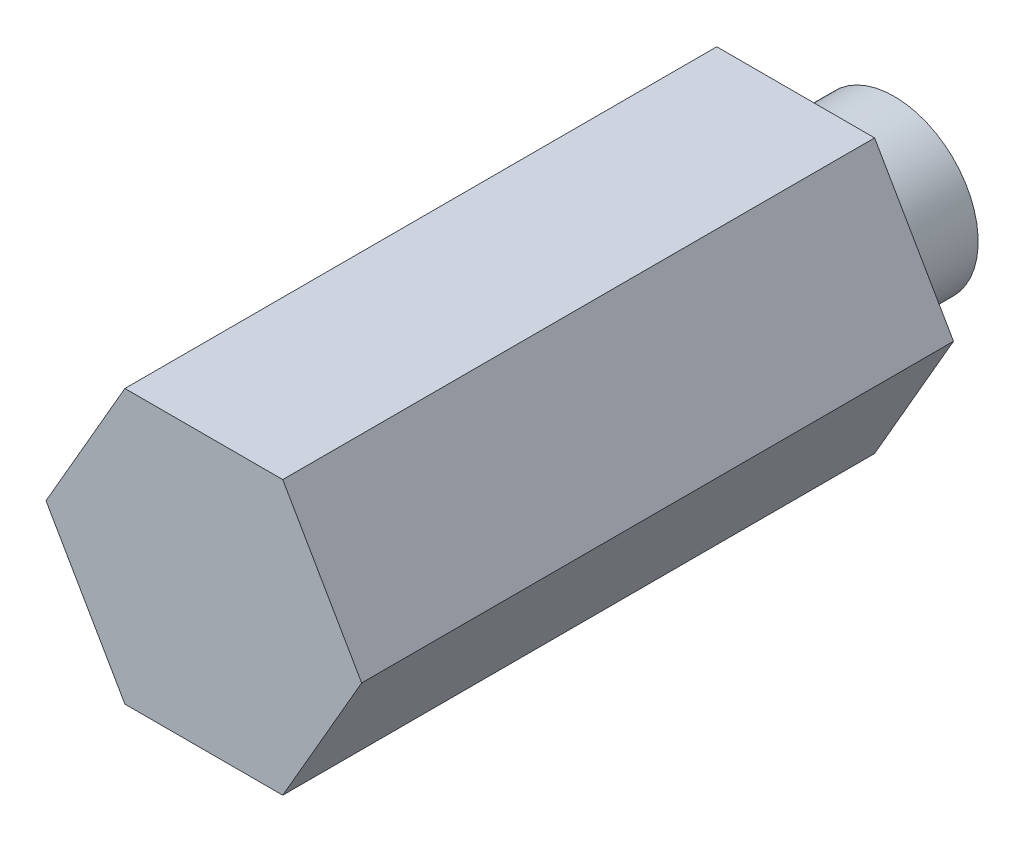
ISO-10303-21;
HEADER;
FILE_DESCRIPTION(('STEP AP214'),'2;1');
FILE_NAME('part.step','',(''),(''),'','','');
FILE_SCHEMA(('AUTOMOTIVE_DESIGN { 1 0 10303 214 1 1 1 1 }'));
ENDSEC;
DATA;
#1=APPLICATION_CONTEXT('core data for automotive mechanical design processes');
#2=APPLICATION_PROTOCOL_DEFINITION('international standard','automotive_design',2000,#1);
#3=PRODUCT_CONTEXT('',#1,'mechanical');
#4=PRODUCT('Part','Part','',(#3));
#5=PRODUCT_RELATED_PRODUCT_CATEGORY('part','',(#4));
#6=PRODUCT_DEFINITION_FORMATION('','',#4);
#7=PRODUCT_DEFINITION_CONTEXT('part definition',#1,'design');
#8=PRODUCT_DEFINITION('design','',#6,#7);
#9=PRODUCT_DEFINITION_SHAPE('','',#8);
#10=(LENGTH_UNIT() NAMED_UNIT(*) SI_UNIT(.MILLI.,.METRE.));
#11=(NAMED_UNIT(*) PLANE_ANGLE_UNIT() SI_UNIT($,.RADIAN.));
#12=(NAMED_UNIT(*) SI_UNIT($,.STERADIAN.) SOLID_ANGLE_UNIT());
#13=UNCERTAINTY_MEASURE_WITH_UNIT(LENGTH_MEASURE(1.E-05),#10,'distance_accuracy_value','');
#14=(GEOMETRIC_REPRESENTATION_CONTEXT(3) GLOBAL_UNCERTAINTY_ASSIGNED_CONTEXT((#13)) GLOBAL_UNIT_ASSIGNED_CONTEXT((#10,
#11,#12)) REPRESENTATION_CONTEXT('',''));
#15=CARTESIAN_POINT('',(0.,0.,0.));
#16=DIRECTION('',(0.,0.,1.));
#17=DIRECTION('',(1.,0.,0.));
#18=AXIS2_PLACEMENT_3D('',#15,#16,#17);
#19=CARTESIAN_POINT('',(3.2,0.,12.));
#20=DIRECTION('',(-0.866025403784432,-0.500000000000011,0.));
#21=DIRECTION('',(0.500000000000011,-0.866025403784432,0.));
#22=AXIS2_PLACEMENT_3D('',#19,#20,#21);
#23=PLANE('',#22);
#24=DIRECTION('',(-0.500000000000011,0.866025403784432,0.));
#25=VECTOR('',#24,1.);
#26=CARTESIAN_POINT('',(3.2,0.,0.));
#27=LINE('',#26,#25);
#28=CARTESIAN_POINT('',(3.2,0.,0.));
#29=VERTEX_POINT('',#28);
#30=CARTESIAN_POINT('',(1.59999999999996,2.77128129211023,0.));
#31=VERTEX_POINT('',#30);
#32=EDGE_CURVE('E130',#29,#31,#27,.T.);
#33=ORIENTED_EDGE('',*,*,#32,.T.);
#34=DIRECTION('',(0.,0.,-1.));
#35=VECTOR('',#34,1.);
#36=CARTESIAN_POINT('',(1.59999999999996,2.77128129211023,12.));
#37=LINE('',#36,#35);
#38=CARTESIAN_POINT('',(1.59999999999996,2.77128129211023,12.));
#39=VERTEX_POINT('',#38);
#40=EDGE_CURVE('E42',#39,#31,#37,.T.);
#41=ORIENTED_EDGE('',*,*,#40,.F.);
#42=DIRECTION('',(-0.500000000000011,0.866025403784432,0.));
#43=VECTOR('',#42,1.);
#44=CARTESIAN_POINT('',(3.2,0.,12.));
#45=LINE('',#44,#43);
#46=CARTESIAN_POINT('',(3.2,0.,12.));
#47=VERTEX_POINT('',#46);
#48=EDGE_CURVE('E147',#47,#39,#45,.T.);
#49=ORIENTED_EDGE('',*,*,#48,.F.);
#50=DIRECTION('',(0.,0.,-1.));
#51=VECTOR('',#50,1.);
#52=CARTESIAN_POINT('',(3.2,0.,12.));
#53=LINE('',#52,#51);
#54=EDGE_CURVE('E126',#47,#29,#53,.T.);
#55=ORIENTED_EDGE('',*,*,#54,.T.);
#56=EDGE_LOOP('',(#33,#41,#49,#55));
#57=FACE_BOUND('',#56,.T.);
#58=ADVANCED_FACE('F39',(#57),#23,.F.);
#59=CARTESIAN_POINT('',(1.59999999999996,2.77128129211023,12.));
#60=DIRECTION('',(0.,-1.,0.));
#61=DIRECTION('',(1.,0.,0.));
#62=AXIS2_PLACEMENT_3D('',#59,#60,#61);
#63=PLANE('',#62);
#64=DIRECTION('',(-1.,0.,0.));
#65=VECTOR('',#64,1.);
#66=CARTESIAN_POINT('',(1.59999999999996,2.77128129211023,0.));
#67=LINE('',#66,#65);
#68=CARTESIAN_POINT('',(-1.60000000000004,2.77128129211018,0.));
#69=VERTEX_POINT('',#68);
#70=EDGE_CURVE('E134',#31,#69,#67,.T.);
#71=ORIENTED_EDGE('',*,*,#70,.T.);
#72=DIRECTION('',(0.,0.,-1.));
#73=VECTOR('',#72,1.);
#74=CARTESIAN_POINT('',(-1.60000000000004,2.77128129211018,12.));
#75=LINE('',#74,#73);
#76=CARTESIAN_POINT('',(-1.60000000000004,2.77128129211018,12.));
#77=VERTEX_POINT('',#76);
#78=EDGE_CURVE('E153',#77,#69,#75,.T.);
#79=ORIENTED_EDGE('',*,*,#78,.F.);
#80=DIRECTION('',(-1.,0.,0.));
#81=VECTOR('',#80,1.);
#82=CARTESIAN_POINT('',(1.59999999999996,2.77128129211023,12.));
#83=LINE('',#82,#81);
#84=EDGE_CURVE('E95',#39,#77,#83,.T.);
#85=ORIENTED_EDGE('',*,*,#84,.F.);
#86=ORIENTED_EDGE('',*,*,#40,.T.);
#87=EDGE_LOOP('',(#71,#79,#85,#86));
#88=FACE_BOUND('',#87,.T.);
#89=ADVANCED_FACE('F160',(#88),#63,.F.);
#90=CARTESIAN_POINT('',(-1.60000000000004,2.77128129211018,12.));
#91=DIRECTION('',(0.866025403784445,-0.499999999999989,0.));
#92=DIRECTION('',(0.499999999999989,0.866025403784445,0.));
#93=AXIS2_PLACEMENT_3D('',#90,#91,#92);
#94=PLANE('',#93);
#95=DIRECTION('',(-0.499999999999989,-0.866025403784445,0.));
#96=VECTOR('',#95,1.);
#97=CARTESIAN_POINT('',(-1.60000000000004,2.77128129211018,0.));
#98=LINE('',#97,#96);
#99=CARTESIAN_POINT('',(-3.2,0.,0.));
#100=VERTEX_POINT('',#99);
#101=EDGE_CURVE('E138',#69,#100,#98,.T.);
#102=ORIENTED_EDGE('',*,*,#101,.T.);
#103=DIRECTION('',(0.,0.,-1.));
#104=VECTOR('',#103,1.);
#105=CARTESIAN_POINT('',(-3.2,0.,12.));
#106=LINE('',#105,#104);
#107=CARTESIAN_POINT('',(-3.2,0.,12.));
#108=VERTEX_POINT('',#107);
#109=EDGE_CURVE('E119',#108,#100,#106,.T.);
#110=ORIENTED_EDGE('',*,*,#109,.F.);
#111=DIRECTION('',(-0.499999999999989,-0.866025403784445,0.));
#112=VECTOR('',#111,1.);
#113=CARTESIAN_POINT('',(-1.60000000000004,2.77128129211018,12.));
#114=LINE('',#113,#112);
#115=EDGE_CURVE('E108',#77,#108,#114,.T.);
#116=ORIENTED_EDGE('',*,*,#115,.F.);
#117=ORIENTED_EDGE('',*,*,#78,.T.);
#118=EDGE_LOOP('',(#102,#110,#116,#117));
#119=FACE_BOUND('',#118,.T.);
#120=ADVANCED_FACE('F166',(#119),#94,.F.);
#121=CARTESIAN_POINT('',(-3.2,0.,12.));
#122=DIRECTION('',(0.866025403784432,0.500000000000012,0.));
#123=DIRECTION('',(-0.500000000000012,0.866025403784432,0.));
#124=AXIS2_PLACEMENT_3D('',#121,#122,#123);
#125=PLANE('',#124);
#126=DIRECTION('',(0.500000000000012,-0.866025403784432,0.));
#127=VECTOR('',#126,1.);
#128=CARTESIAN_POINT('',(-3.2,0.,0.));
#129=LINE('',#128,#127);
#130=CARTESIAN_POINT('',(-1.59999999999996,-2.77128129211023,0.));
#131=VERTEX_POINT('',#130);
#132=EDGE_CURVE('E117',#100,#131,#129,.T.);
#133=ORIENTED_EDGE('',*,*,#132,.T.);
#134=DIRECTION('',(0.,0.,-1.));
#135=VECTOR('',#134,1.);
#136=CARTESIAN_POINT('',(-1.59999999999996,-2.77128129211023,12.));
#137=LINE('',#136,#135);
#138=CARTESIAN_POINT('',(-1.59999999999996,-2.77128129211023,12.));
#139=VERTEX_POINT('',#138);
#140=EDGE_CURVE('E114',#139,#131,#137,.T.);
#141=ORIENTED_EDGE('',*,*,#140,.F.);
#142=DIRECTION('',(0.500000000000012,-0.866025403784432,0.));
#143=VECTOR('',#142,1.);
#144=CARTESIAN_POINT('',(-3.2,0.,12.));
#145=LINE('',#144,#143);
#146=EDGE_CURVE('E102',#108,#139,#145,.T.);
#147=ORIENTED_EDGE('',*,*,#146,.F.);
#148=ORIENTED_EDGE('',*,*,#109,.T.);
#149=EDGE_LOOP('',(#133,#141,#147,#148));
#150=FACE_BOUND('',#149,.T.);
#151=ADVANCED_FACE('F115',(#150),#125,.F.);
#152=CARTESIAN_POINT('',(-1.59999999999996,-2.77128129211023,12.));
#153=DIRECTION('',(0.,1.,0.));
#154=DIRECTION('',(-1.,0.,0.));
#155=AXIS2_PLACEMENT_3D('',#152,#153,#154);
#156=PLANE('',#155);
#157=DIRECTION('',(1.,0.,0.));
#158=VECTOR('',#157,1.);
#159=CARTESIAN_POINT('',(-1.59999999999996,-2.77128129211023,0.));
#160=LINE('',#159,#158);
#161=CARTESIAN_POINT('',(1.60000000000004,-2.77128129211019,0.));
#162=VERTEX_POINT('',#161);
#163=EDGE_CURVE('E80',#131,#162,#160,.T.);
#164=ORIENTED_EDGE('',*,*,#163,.T.);
#165=DIRECTION('',(0.,0.,-1.));
#166=VECTOR('',#165,1.);
#167=CARTESIAN_POINT('',(1.60000000000004,-2.77128129211019,12.));
#168=LINE('',#167,#166);
#169=CARTESIAN_POINT('',(1.60000000000004,-2.77128129211019,12.));
#170=VERTEX_POINT('',#169);
#171=EDGE_CURVE('E120',#170,#162,#168,.T.);
#172=ORIENTED_EDGE('',*,*,#171,.F.);
#173=DIRECTION('',(1.,0.,0.));
#174=VECTOR('',#173,1.);
#175=CARTESIAN_POINT('',(-1.59999999999996,-2.77128129211023,12.));
#176=LINE('',#175,#174);
#177=EDGE_CURVE('E106',#139,#170,#176,.T.);
#178=ORIENTED_EDGE('',*,*,#177,.F.);
#179=ORIENTED_EDGE('',*,*,#140,.T.);
#180=EDGE_LOOP('',(#164,#172,#178,#179));
#181=FACE_BOUND('',#180,.T.);
#182=ADVANCED_FACE('F122',(#181),#156,.F.);
#183=CARTESIAN_POINT('',(1.60000000000004,-2.77128129211019,12.));
#184=DIRECTION('',(-0.866025403784445,0.499999999999989,0.));
#185=DIRECTION('',(-0.499999999999989,-0.866025403784445,0.));
#186=AXIS2_PLACEMENT_3D('',#183,#184,#185);
#187=PLANE('',#186);
#188=DIRECTION('',(0.499999999999989,0.866025403784445,0.));
#189=VECTOR('',#188,1.);
#190=CARTESIAN_POINT('',(1.60000000000004,-2.77128129211019,0.));
#191=LINE('',#190,#189);
#192=EDGE_CURVE('E86',#162,#29,#191,.T.);
#193=ORIENTED_EDGE('',*,*,#192,.T.);
#194=ORIENTED_EDGE('',*,*,#54,.F.);
#195=DIRECTION('',(0.499999999999989,0.866025403784445,0.));
#196=VECTOR('',#195,1.);
#197=CARTESIAN_POINT('',(1.60000000000004,-2.77128129211019,12.));
#198=LINE('',#197,#196);
#199=EDGE_CURVE('E57',#170,#47,#198,.T.);
#200=ORIENTED_EDGE('',*,*,#199,.F.);
#201=ORIENTED_EDGE('',*,*,#171,.T.);
#202=EDGE_LOOP('',(#193,#194,#200,#201));
#203=FACE_BOUND('',#202,.T.);
#204=ADVANCED_FACE('F190',(#203),#187,.F.);
#205=CARTESIAN_POINT('',(0.,0.,12.));
#206=DIRECTION('',(0.,0.,1.));
#207=DIRECTION('',(1.,0.,0.));
#208=AXIS2_PLACEMENT_3D('',#205,#206,#207);
#209=PLANE('',#208);
#210=ORIENTED_EDGE('',*,*,#48,.T.);
#211=ORIENTED_EDGE('',*,*,#84,.T.);
#212=ORIENTED_EDGE('',*,*,#115,.T.);
#213=ORIENTED_EDGE('',*,*,#146,.T.);
#214=ORIENTED_EDGE('',*,*,#177,.T.);
#215=ORIENTED_EDGE('',*,*,#199,.T.);
#216=EDGE_LOOP('',(#210,#211,#212,#213,#214,#215));
#217=FACE_BOUND('',#216,.T.);
#218=ADVANCED_FACE('F104',(#217),#209,.T.);
#219=CARTESIAN_POINT('',(0.,0.,0.));
#220=DIRECTION('',(0.,0.,1.));
#221=DIRECTION('',(1.,0.,0.));
#222=AXIS2_PLACEMENT_3D('',#219,#220,#221);
#223=PLANE('',#222);
#224=CARTESIAN_POINT('',(0.,0.,0.));
#225=DIRECTION('',(0.,0.,-1.));
#226=DIRECTION('',(-1.,0.,0.));
#227=AXIS2_PLACEMENT_3D('',#224,#225,#226);
#228=CIRCLE('',#227,1.7);
#229=CARTESIAN_POINT('',(-1.7,0.,0.));
#230=VERTEX_POINT('',#229);
#231=EDGE_CURVE('E11',#230,#230,#228,.T.);
#232=ORIENTED_EDGE('',*,*,#231,.F.);
#233=EDGE_LOOP('',(#232));
#234=FACE_BOUND('',#233,.T.);
#235=ORIENTED_EDGE('',*,*,#32,.F.);
#236=ORIENTED_EDGE('',*,*,#192,.F.);
#237=ORIENTED_EDGE('',*,*,#163,.F.);
#238=ORIENTED_EDGE('',*,*,#132,.F.);
#239=ORIENTED_EDGE('',*,*,#101,.F.);
#240=ORIENTED_EDGE('',*,*,#70,.F.);
#241=EDGE_LOOP('',(#235,#236,#237,#238,#239,#240));
#242=FACE_BOUND('',#241,.T.);
#243=ADVANCED_FACE('F165',(#234,#242),#223,.F.);
#244=CARTESIAN_POINT('',(0.,0.,-2.));
#245=DIRECTION('',(0.,0.,1.));
#246=DIRECTION('',(1.,0.,0.));
#247=AXIS2_PLACEMENT_3D('',#244,#245,#246);
#248=CYLINDRICAL_SURFACE('',#247,1.7);
#249=CARTESIAN_POINT('',(0.,0.,-2.));
#250=DIRECTION('',(0.,0.,-1.));
#251=DIRECTION('',(-1.,0.,0.));
#252=AXIS2_PLACEMENT_3D('',#249,#250,#251);
#253=CIRCLE('',#252,1.7);
#254=CARTESIAN_POINT('',(-1.7,0.,-2.));
#255=VERTEX_POINT('',#254);
#256=EDGE_CURVE('E135',#255,#255,#253,.T.);
#257=ORIENTED_EDGE('',*,*,#256,.F.);
#258=EDGE_LOOP('',(#257));
#259=FACE_BOUND('',#258,.T.);
#260=ORIENTED_EDGE('',*,*,#231,.T.);
#261=EDGE_LOOP('',(#260));
#262=FACE_BOUND('',#261,.T.);
#263=ADVANCED_FACE('F179',(#259,#262),#248,.T.);
#264=CARTESIAN_POINT('',(0.,0.,-2.));
#265=DIRECTION('',(0.,0.,-1.));
#266=DIRECTION('',(-1.,0.,0.));
#267=AXIS2_PLACEMENT_3D('',#264,#265,#266);
#268=PLANE('',#267);
#269=ORIENTED_EDGE('',*,*,#256,.T.);
#270=EDGE_LOOP('',(#269));
#271=FACE_BOUND('',#270,.T.);
#272=ADVANCED_FACE('F177',(#271),#268,.T.);
#273=CLOSED_SHELL('',(#58,#89,#120,#151,#182,#204,#218,#243,#263,#272));
#274=MANIFOLD_SOLID_BREP('B2',#273);
#275=ADVANCED_BREP_SHAPE_REPRESENTATION('',(#18,#274),#14);
#276=SHAPE_DEFINITION_REPRESENTATION(#9,#275);
ENDSEC;
END-ISO-10303-21;
